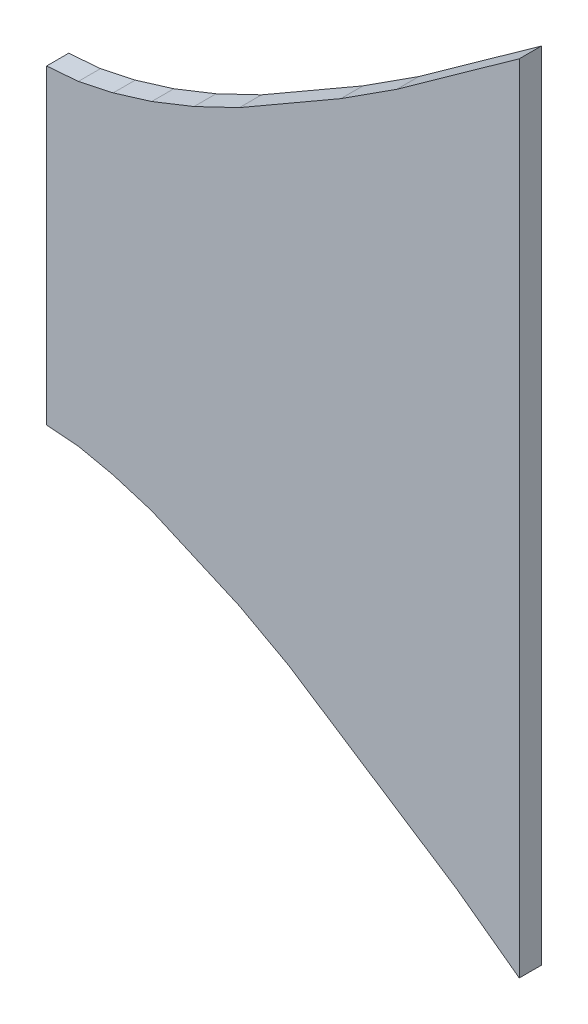
ISO-10303-21;
HEADER;
FILE_DESCRIPTION(('STEP AP214'),'2;1');
FILE_NAME('part.step','',(''),(''),'','','');
FILE_SCHEMA(('AUTOMOTIVE_DESIGN { 1 0 10303 214 1 1 1 1 }'));
ENDSEC;
DATA;
#1=APPLICATION_CONTEXT('core data for automotive mechanical design processes');
#2=APPLICATION_PROTOCOL_DEFINITION('international standard','automotive_design',2000,#1);
#3=PRODUCT_CONTEXT('',#1,'mechanical');
#4=PRODUCT('Part','Part','',(#3));
#5=PRODUCT_RELATED_PRODUCT_CATEGORY('part','',(#4));
#6=PRODUCT_DEFINITION_FORMATION('','',#4);
#7=PRODUCT_DEFINITION_CONTEXT('part definition',#1,'design');
#8=PRODUCT_DEFINITION('design','',#6,#7);
#9=PRODUCT_DEFINITION_SHAPE('','',#8);
#10=(LENGTH_UNIT() NAMED_UNIT(*) SI_UNIT(.MILLI.,.METRE.));
#11=(NAMED_UNIT(*) PLANE_ANGLE_UNIT() SI_UNIT($,.RADIAN.));
#12=(NAMED_UNIT(*) SI_UNIT($,.STERADIAN.) SOLID_ANGLE_UNIT());
#13=UNCERTAINTY_MEASURE_WITH_UNIT(LENGTH_MEASURE(1.E-05),#10,'distance_accuracy_value','');
#14=(GEOMETRIC_REPRESENTATION_CONTEXT(3) GLOBAL_UNCERTAINTY_ASSIGNED_CONTEXT((#13)) GLOBAL_UNIT_ASSIGNED_CONTEXT((#10,
#11,#12)) REPRESENTATION_CONTEXT('',''));
#15=CARTESIAN_POINT('',(0.,0.,0.));
#16=DIRECTION('',(0.,0.,1.));
#17=DIRECTION('',(1.,0.,0.));
#18=AXIS2_PLACEMENT_3D('',#15,#16,#17);
#19=CARTESIAN_POINT('',(100.160003662109,112.25,0.));
#20=DIRECTION('',(0.0781563649263617,0.996941112915651,0.));
#21=DIRECTION('',(0.996941112915651,-0.0781563649263617,0.));
#22=AXIS2_PLACEMENT_3D('',#19,#20,#21);
#23=PLANE('',#22);
#24=DIRECTION('',(0.996941112915651,-0.0781563649263616,0.));
#25=VECTOR('',#24,1.);
#26=CARTESIAN_POINT('',(100.160003662109,112.25,0.03556));
#27=LINE('',#26,#25);
#28=CARTESIAN_POINT('',(100.160003662109,112.25,0.03556));
#29=VERTEX_POINT('',#28);
#30=CARTESIAN_POINT('',(100.210998535156,112.246002197266,0.03556));
#31=VERTEX_POINT('',#30);
#32=EDGE_CURVE('E11',#29,#31,#27,.T.);
#33=ORIENTED_EDGE('',*,*,#32,.F.);
#34=DIRECTION('',(0.,0.,1.));
#35=VECTOR('',#34,1.);
#36=CARTESIAN_POINT('',(100.160003662109,112.25,0.));
#37=LINE('',#36,#35);
#38=CARTESIAN_POINT('',(100.160003662109,112.25,0.));
#39=VERTEX_POINT('',#38);
#40=EDGE_CURVE('E24',#39,#29,#37,.T.);
#41=ORIENTED_EDGE('',*,*,#40,.F.);
#42=DIRECTION('',(0.996941112915651,-0.0781563649263616,0.));
#43=VECTOR('',#42,1.);
#44=CARTESIAN_POINT('',(100.160003662109,112.25,0.));
#45=LINE('',#44,#43);
#46=CARTESIAN_POINT('',(100.210998535156,112.246002197266,0.));
#47=VERTEX_POINT('',#46);
#48=EDGE_CURVE('E154',#39,#47,#45,.T.);
#49=ORIENTED_EDGE('',*,*,#48,.T.);
#50=DIRECTION('',(0.,0.,1.));
#51=VECTOR('',#50,1.);
#52=CARTESIAN_POINT('',(100.210998535156,112.246002197266,0.));
#53=LINE('',#52,#51);
#54=EDGE_CURVE('E37',#47,#31,#53,.T.);
#55=ORIENTED_EDGE('',*,*,#54,.T.);
#56=EDGE_LOOP('',(#33,#41,#49,#55));
#57=FACE_BOUND('',#56,.T.);
#58=ADVANCED_FACE('F17',(#57),#23,.F.);
#59=CARTESIAN_POINT('',(100.210998535156,112.246002197266,0.));
#60=DIRECTION('',(0.20954728392183,0.977798514930854,0.));
#61=DIRECTION('',(0.977798514930854,-0.20954728392183,0.));
#62=AXIS2_PLACEMENT_3D('',#59,#60,#61);
#63=PLANE('',#62);
#64=DIRECTION('',(0.977798514930854,-0.20954728392183,0.));
#65=VECTOR('',#64,1.);
#66=CARTESIAN_POINT('',(100.210998535156,112.246002197266,0.03556));
#67=LINE('',#66,#65);
#68=CARTESIAN_POINT('',(100.266998291016,112.234001159668,0.03556));
#69=VERTEX_POINT('',#68);
#70=EDGE_CURVE('E266',#31,#69,#67,.T.);
#71=ORIENTED_EDGE('',*,*,#70,.F.);
#72=ORIENTED_EDGE('',*,*,#54,.F.);
#73=DIRECTION('',(0.977798514930854,-0.20954728392183,0.));
#74=VECTOR('',#73,1.);
#75=CARTESIAN_POINT('',(100.210998535156,112.246002197266,0.));
#76=LINE('',#75,#74);
#77=CARTESIAN_POINT('',(100.266998291016,112.234001159668,0.));
#78=VERTEX_POINT('',#77);
#79=EDGE_CURVE('E263',#47,#78,#76,.T.);
#80=ORIENTED_EDGE('',*,*,#79,.T.);
#81=DIRECTION('',(0.,0.,1.));
#82=VECTOR('',#81,1.);
#83=CARTESIAN_POINT('',(100.266998291016,112.234001159668,0.));
#84=LINE('',#83,#82);
#85=EDGE_CURVE('E261',#78,#69,#84,.T.);
#86=ORIENTED_EDGE('',*,*,#85,.T.);
#87=EDGE_LOOP('',(#71,#72,#80,#86));
#88=FACE_BOUND('',#87,.T.);
#89=ADVANCED_FACE('F274',(#88),#63,.F.);
#90=CARTESIAN_POINT('',(100.266998291016,112.234001159668,0.));
#91=DIRECTION('',(0.293052313581465,0.956096408059643,0.));
#92=DIRECTION('',(0.956096408059643,-0.293052313581465,0.));
#93=AXIS2_PLACEMENT_3D('',#90,#91,#92);
#94=PLANE('',#93);
#95=DIRECTION('',(0.956096408059643,-0.293052313581465,0.));
#96=VECTOR('',#95,1.);
#97=CARTESIAN_POINT('',(100.266998291016,112.234001159668,0.03556));
#98=LINE('',#97,#96);
#99=CARTESIAN_POINT('',(100.329002380371,112.214996337891,0.03556));
#100=VERTEX_POINT('',#99);
#101=EDGE_CURVE('E258',#69,#100,#98,.T.);
#102=ORIENTED_EDGE('',*,*,#101,.F.);
#103=ORIENTED_EDGE('',*,*,#85,.F.);
#104=DIRECTION('',(0.956096408059643,-0.293052313581465,0.));
#105=VECTOR('',#104,1.);
#106=CARTESIAN_POINT('',(100.266998291016,112.234001159668,0.));
#107=LINE('',#106,#105);
#108=CARTESIAN_POINT('',(100.329002380371,112.214996337891,0.));
#109=VERTEX_POINT('',#108);
#110=EDGE_CURVE('E255',#78,#109,#107,.T.);
#111=ORIENTED_EDGE('',*,*,#110,.T.);
#112=DIRECTION('',(0.,0.,1.));
#113=VECTOR('',#112,1.);
#114=CARTESIAN_POINT('',(100.329002380371,112.214996337891,0.));
#115=LINE('',#114,#113);
#116=EDGE_CURVE('E253',#109,#100,#115,.T.);
#117=ORIENTED_EDGE('',*,*,#116,.T.);
#118=EDGE_LOOP('',(#102,#103,#111,#117));
#119=FACE_BOUND('',#118,.T.);
#120=ADVANCED_FACE('F280',(#119),#94,.F.);
#121=CARTESIAN_POINT('',(100.329002380371,112.214996337891,0.));
#122=DIRECTION('',(0.402504548069156,0.915417985831415,0.));
#123=DIRECTION('',(0.915417985831415,-0.402504548069156,0.));
#124=AXIS2_PLACEMENT_3D('',#121,#122,#123);
#125=PLANE('',#124);
#126=DIRECTION('',(0.915417985831415,-0.402504548069156,0.));
#127=VECTOR('',#126,1.);
#128=CARTESIAN_POINT('',(100.329002380371,112.214996337891,0.03556));
#129=LINE('',#128,#127);
#130=CARTESIAN_POINT('',(100.470001220703,112.15299987793,0.03556));
#131=VERTEX_POINT('',#130);
#132=EDGE_CURVE('E250',#100,#131,#129,.T.);
#133=ORIENTED_EDGE('',*,*,#132,.F.);
#134=ORIENTED_EDGE('',*,*,#116,.F.);
#135=DIRECTION('',(0.915417985831415,-0.402504548069156,0.));
#136=VECTOR('',#135,1.);
#137=CARTESIAN_POINT('',(100.329002380371,112.214996337891,0.));
#138=LINE('',#137,#136);
#139=CARTESIAN_POINT('',(100.470001220703,112.15299987793,0.));
#140=VERTEX_POINT('',#139);
#141=EDGE_CURVE('E247',#109,#140,#138,.T.);
#142=ORIENTED_EDGE('',*,*,#141,.T.);
#143=DIRECTION('',(0.,0.,1.));
#144=VECTOR('',#143,1.);
#145=CARTESIAN_POINT('',(100.470001220703,112.15299987793,0.));
#146=LINE('',#145,#144);
#147=EDGE_CURVE('E245',#140,#131,#146,.T.);
#148=ORIENTED_EDGE('',*,*,#147,.T.);
#149=EDGE_LOOP('',(#133,#134,#142,#148));
#150=FACE_BOUND('',#149,.T.);
#151=ADVANCED_FACE('F282',(#150),#125,.F.);
#152=CARTESIAN_POINT('',(100.470001220703,112.15299987793,0.));
#153=DIRECTION('',(0.478055581365163,0.878329585705512,0.));
#154=DIRECTION('',(0.878329585705512,-0.478055581365163,0.));
#155=AXIS2_PLACEMENT_3D('',#152,#153,#154);
#156=PLANE('',#155);
#157=DIRECTION('',(0.878329585705512,-0.478055581365163,0.));
#158=VECTOR('',#157,1.);
#159=CARTESIAN_POINT('',(100.470001220703,112.15299987793,0.03556));
#160=LINE('',#159,#158);
#161=CARTESIAN_POINT('',(100.549003601074,112.110000610352,0.03556));
#162=VERTEX_POINT('',#161);
#163=EDGE_CURVE('E242',#131,#162,#160,.T.);
#164=ORIENTED_EDGE('',*,*,#163,.F.);
#165=ORIENTED_EDGE('',*,*,#147,.F.);
#166=DIRECTION('',(0.878329585705512,-0.478055581365163,0.));
#167=VECTOR('',#166,1.);
#168=CARTESIAN_POINT('',(100.470001220703,112.15299987793,0.));
#169=LINE('',#168,#167);
#170=CARTESIAN_POINT('',(100.549003601074,112.110000610352,0.));
#171=VERTEX_POINT('',#170);
#172=EDGE_CURVE('E239',#140,#171,#169,.T.);
#173=ORIENTED_EDGE('',*,*,#172,.T.);
#174=DIRECTION('',(0.,0.,1.));
#175=VECTOR('',#174,1.);
#176=CARTESIAN_POINT('',(100.549003601074,112.110000610352,0.));
#177=LINE('',#176,#175);
#178=EDGE_CURVE('E237',#171,#162,#177,.T.);
#179=ORIENTED_EDGE('',*,*,#178,.T.);
#180=EDGE_LOOP('',(#164,#165,#173,#179));
#181=FACE_BOUND('',#180,.T.);
#182=ADVANCED_FACE('F287',(#181),#156,.F.);
#183=CARTESIAN_POINT('',(100.549003601074,112.110000610352,0.));
#184=DIRECTION('',(0.546088689918585,0.837727367789189,0.));
#185=DIRECTION('',(0.837727367789189,-0.546088689918585,0.));
#186=AXIS2_PLACEMENT_3D('',#183,#184,#185);
#187=PLANE('',#186);
#188=DIRECTION('',(0.837727367789189,-0.546088689918585,0.));
#189=VECTOR('',#188,1.);
#190=CARTESIAN_POINT('',(100.549003601074,112.110000610352,0.03556));
#191=LINE('',#190,#189);
#192=CARTESIAN_POINT('',(100.819000244141,111.93399810791,0.03556));
#193=VERTEX_POINT('',#192);
#194=EDGE_CURVE('E234',#162,#193,#191,.T.);
#195=ORIENTED_EDGE('',*,*,#194,.F.);
#196=ORIENTED_EDGE('',*,*,#178,.F.);
#197=DIRECTION('',(0.837727367789189,-0.546088689918585,0.));
#198=VECTOR('',#197,1.);
#199=CARTESIAN_POINT('',(100.549003601074,112.110000610352,0.));
#200=LINE('',#199,#198);
#201=CARTESIAN_POINT('',(100.819000244141,111.93399810791,0.));
#202=VERTEX_POINT('',#201);
#203=EDGE_CURVE('E231',#171,#202,#200,.T.);
#204=ORIENTED_EDGE('',*,*,#203,.T.);
#205=DIRECTION('',(0.,0.,1.));
#206=VECTOR('',#205,1.);
#207=CARTESIAN_POINT('',(100.819000244141,111.93399810791,0.));
#208=LINE('',#207,#206);
#209=EDGE_CURVE('E229',#202,#193,#208,.T.);
#210=ORIENTED_EDGE('',*,*,#209,.T.);
#211=EDGE_LOOP('',(#195,#196,#204,#210));
#212=FACE_BOUND('',#211,.T.);
#213=ADVANCED_FACE('F290',(#212),#187,.F.);
#214=CARTESIAN_POINT('',(100.819000244141,111.93399810791,0.));
#215=DIRECTION('',(0.591012260431237,0.80666257383119,0.));
#216=DIRECTION('',(0.80666257383119,-0.591012260431237,0.));
#217=AXIS2_PLACEMENT_3D('',#214,#215,#216);
#218=PLANE('',#217);
#219=DIRECTION('',(0.80666257383119,-0.591012260431237,0.));
#220=VECTOR('',#219,1.);
#221=CARTESIAN_POINT('',(100.819000244141,111.93399810791,0.03556));
#222=LINE('',#221,#220);
#223=CARTESIAN_POINT('',(100.919998168945,111.860000610352,0.03556));
#224=VERTEX_POINT('',#223);
#225=EDGE_CURVE('E226',#193,#224,#222,.T.);
#226=ORIENTED_EDGE('',*,*,#225,.F.);
#227=ORIENTED_EDGE('',*,*,#209,.F.);
#228=DIRECTION('',(0.80666257383119,-0.591012260431237,0.));
#229=VECTOR('',#228,1.);
#230=CARTESIAN_POINT('',(100.819000244141,111.93399810791,0.));
#231=LINE('',#230,#229);
#232=CARTESIAN_POINT('',(100.919998168945,111.860000610352,0.));
#233=VERTEX_POINT('',#232);
#234=EDGE_CURVE('E223',#202,#233,#231,.T.);
#235=ORIENTED_EDGE('',*,*,#234,.T.);
#236=DIRECTION('',(0.,0.,1.));
#237=VECTOR('',#236,1.);
#238=CARTESIAN_POINT('',(100.919998168945,111.860000610352,0.));
#239=LINE('',#238,#237);
#240=EDGE_CURVE('E221',#233,#224,#239,.T.);
#241=ORIENTED_EDGE('',*,*,#240,.T.);
#242=EDGE_LOOP('',(#226,#227,#235,#241));
#243=FACE_BOUND('',#242,.T.);
#244=ADVANCED_FACE('F295',(#243),#218,.F.);
#245=CARTESIAN_POINT('',(100.919998168945,111.860000610352,0.));
#246=DIRECTION('',(-1.,0.,0.));
#247=DIRECTION('',(0.,1.,0.));
#248=AXIS2_PLACEMENT_3D('',#245,#246,#247);
#249=PLANE('',#248);
#250=DIRECTION('',(0.,1.,0.));
#251=VECTOR('',#250,1.);
#252=CARTESIAN_POINT('',(100.919998168945,111.860000610352,0.03556));
#253=LINE('',#252,#251);
#254=CARTESIAN_POINT('',(100.919998168945,113.139999389648,0.03556));
#255=VERTEX_POINT('',#254);
#256=EDGE_CURVE('E218',#224,#255,#253,.T.);
#257=ORIENTED_EDGE('',*,*,#256,.F.);
#258=ORIENTED_EDGE('',*,*,#240,.F.);
#259=DIRECTION('',(0.,1.,0.));
#260=VECTOR('',#259,1.);
#261=CARTESIAN_POINT('',(100.919998168945,111.860000610352,0.));
#262=LINE('',#261,#260);
#263=CARTESIAN_POINT('',(100.919998168945,113.139999389648,0.));
#264=VERTEX_POINT('',#263);
#265=EDGE_CURVE('E215',#233,#264,#262,.T.);
#266=ORIENTED_EDGE('',*,*,#265,.T.);
#267=DIRECTION('',(0.,0.,1.));
#268=VECTOR('',#267,1.);
#269=CARTESIAN_POINT('',(100.919998168945,113.139999389648,0.));
#270=LINE('',#269,#268);
#271=EDGE_CURVE('E213',#264,#255,#270,.T.);
#272=ORIENTED_EDGE('',*,*,#271,.T.);
#273=EDGE_LOOP('',(#257,#258,#266,#272));
#274=FACE_BOUND('',#273,.T.);
#275=ADVANCED_FACE('F298',(#274),#249,.F.);
#276=CARTESIAN_POINT('',(100.919998168945,113.139999389648,0.));
#277=DIRECTION('',(0.582018437092365,-0.813175589208481,0.));
#278=DIRECTION('',(-0.813175589208481,-0.582018437092365,0.));
#279=AXIS2_PLACEMENT_3D('',#276,#277,#278);
#280=PLANE('',#279);
#281=DIRECTION('',(-0.813175589208481,-0.582018437092365,0.));
#282=VECTOR('',#281,1.);
#283=CARTESIAN_POINT('',(100.919998168945,113.139999389648,0.03556));
#284=LINE('',#283,#282);
#285=CARTESIAN_POINT('',(100.722999572754,112.999000549316,0.03556));
#286=VERTEX_POINT('',#285);
#287=EDGE_CURVE('E210',#255,#286,#284,.T.);
#288=ORIENTED_EDGE('',*,*,#287,.F.);
#289=ORIENTED_EDGE('',*,*,#271,.F.);
#290=DIRECTION('',(-0.813175589208481,-0.582018437092365,0.));
#291=VECTOR('',#290,1.);
#292=CARTESIAN_POINT('',(100.919998168945,113.139999389648,0.));
#293=LINE('',#292,#291);
#294=CARTESIAN_POINT('',(100.722999572754,112.999000549316,0.));
#295=VERTEX_POINT('',#294);
#296=EDGE_CURVE('E207',#264,#295,#293,.T.);
#297=ORIENTED_EDGE('',*,*,#296,.T.);
#298=DIRECTION('',(0.,0.,1.));
#299=VECTOR('',#298,1.);
#300=CARTESIAN_POINT('',(100.722999572754,112.999000549316,0.));
#301=LINE('',#300,#299);
#302=EDGE_CURVE('E205',#295,#286,#301,.T.);
#303=ORIENTED_EDGE('',*,*,#302,.T.);
#304=EDGE_LOOP('',(#288,#289,#297,#303));
#305=FACE_BOUND('',#304,.T.);
#306=ADVANCED_FACE('F303',(#305),#280,.F.);
#307=CARTESIAN_POINT('',(100.722999572754,112.999000549316,0.));
#308=DIRECTION('',(0.541708046838841,-0.840566708828067,0.));
#309=DIRECTION('',(-0.840566708828067,-0.541708046838841,0.));
#310=AXIS2_PLACEMENT_3D('',#307,#308,#309);
#311=PLANE('',#310);
#312=DIRECTION('',(-0.840566708828067,-0.541708046838841,0.));
#313=VECTOR('',#312,1.);
#314=CARTESIAN_POINT('',(100.722999572754,112.999000549316,0.03556));
#315=LINE('',#314,#313);
#316=CARTESIAN_POINT('',(100.633003234863,112.94100189209,0.03556));
#317=VERTEX_POINT('',#316);
#318=EDGE_CURVE('E202',#286,#317,#315,.T.);
#319=ORIENTED_EDGE('',*,*,#318,.F.);
#320=ORIENTED_EDGE('',*,*,#302,.F.);
#321=DIRECTION('',(-0.840566708828067,-0.541708046838841,0.));
#322=VECTOR('',#321,1.);
#323=CARTESIAN_POINT('',(100.722999572754,112.999000549316,0.));
#324=LINE('',#323,#322);
#325=CARTESIAN_POINT('',(100.633003234863,112.94100189209,0.));
#326=VERTEX_POINT('',#325);
#327=EDGE_CURVE('E199',#295,#326,#324,.T.);
#328=ORIENTED_EDGE('',*,*,#327,.T.);
#329=DIRECTION('',(0.,0.,1.));
#330=VECTOR('',#329,1.);
#331=CARTESIAN_POINT('',(100.633003234863,112.94100189209,0.));
#332=LINE('',#331,#330);
#333=EDGE_CURVE('E197',#326,#317,#332,.T.);
#334=ORIENTED_EDGE('',*,*,#333,.T.);
#335=EDGE_LOOP('',(#319,#320,#328,#334));
#336=FACE_BOUND('',#335,.T.);
#337=ADVANCED_FACE('F306',(#336),#311,.F.);
#338=CARTESIAN_POINT('',(100.633003234863,112.94100189209,0.));
#339=DIRECTION('',(0.49957151089777,-0.866272650785721,0.));
#340=DIRECTION('',(-0.866272650785721,-0.49957151089777,0.));
#341=AXIS2_PLACEMENT_3D('',#338,#339,#340);
#342=PLANE('',#341);
#343=DIRECTION('',(-0.866272650785721,-0.49957151089777,0.));
#344=VECTOR('',#343,1.);
#345=CARTESIAN_POINT('',(100.633003234863,112.94100189209,0.03556));
#346=LINE('',#345,#344);
#347=CARTESIAN_POINT('',(100.470001220703,112.84700012207,0.03556));
#348=VERTEX_POINT('',#347);
#349=EDGE_CURVE('E194',#317,#348,#346,.T.);
#350=ORIENTED_EDGE('',*,*,#349,.F.);
#351=ORIENTED_EDGE('',*,*,#333,.F.);
#352=DIRECTION('',(-0.866272650785721,-0.49957151089777,0.));
#353=VECTOR('',#352,1.);
#354=CARTESIAN_POINT('',(100.633003234863,112.94100189209,0.));
#355=LINE('',#354,#353);
#356=CARTESIAN_POINT('',(100.470001220703,112.84700012207,0.));
#357=VERTEX_POINT('',#356);
#358=EDGE_CURVE('E191',#326,#357,#355,.T.);
#359=ORIENTED_EDGE('',*,*,#358,.T.);
#360=DIRECTION('',(0.,0.,1.));
#361=VECTOR('',#360,1.);
#362=CARTESIAN_POINT('',(100.470001220703,112.84700012207,0.));
#363=LINE('',#362,#361);
#364=EDGE_CURVE('E189',#357,#348,#363,.T.);
#365=ORIENTED_EDGE('',*,*,#364,.T.);
#366=EDGE_LOOP('',(#350,#351,#359,#365));
#367=FACE_BOUND('',#366,.T.);
#368=ADVANCED_FACE('F311',(#367),#342,.F.);
#369=CARTESIAN_POINT('',(100.470001220703,112.84700012207,0.));
#370=DIRECTION('',(0.432375640471323,-0.901693576292419,0.));
#371=DIRECTION('',(-0.901693576292419,-0.432375640471323,0.));
#372=AXIS2_PLACEMENT_3D('',#369,#370,#371);
#373=PLANE('',#372);
#374=DIRECTION('',(-0.901693576292419,-0.432375640471323,0.));
#375=VECTOR('',#374,1.);
#376=CARTESIAN_POINT('',(100.470001220703,112.84700012207,0.03556));
#377=LINE('',#376,#375);
#378=CARTESIAN_POINT('',(100.397003173828,112.811996459961,0.03556));
#379=VERTEX_POINT('',#378);
#380=EDGE_CURVE('E186',#348,#379,#377,.T.);
#381=ORIENTED_EDGE('',*,*,#380,.F.);
#382=ORIENTED_EDGE('',*,*,#364,.F.);
#383=DIRECTION('',(-0.901693576292419,-0.432375640471323,0.));
#384=VECTOR('',#383,1.);
#385=CARTESIAN_POINT('',(100.470001220703,112.84700012207,0.));
#386=LINE('',#385,#384);
#387=CARTESIAN_POINT('',(100.397003173828,112.811996459961,0.));
#388=VERTEX_POINT('',#387);
#389=EDGE_CURVE('E183',#357,#388,#386,.T.);
#390=ORIENTED_EDGE('',*,*,#389,.T.);
#391=DIRECTION('',(0.,0.,1.));
#392=VECTOR('',#391,1.);
#393=CARTESIAN_POINT('',(100.397003173828,112.811996459961,0.));
#394=LINE('',#393,#392);
#395=EDGE_CURVE('E181',#388,#379,#394,.T.);
#396=ORIENTED_EDGE('',*,*,#395,.T.);
#397=EDGE_LOOP('',(#381,#382,#390,#396));
#398=FACE_BOUND('',#397,.T.);
#399=ADVANCED_FACE('F314',(#398),#373,.F.);
#400=CARTESIAN_POINT('',(100.397003173828,112.811996459961,0.));
#401=DIRECTION('',(0.368944191946395,-0.929451549694239,0.));
#402=DIRECTION('',(-0.929451549694239,-0.368944191946395,0.));
#403=AXIS2_PLACEMENT_3D('',#400,#401,#402);
#404=PLANE('',#403);
#405=DIRECTION('',(-0.929451549694239,-0.368944191946395,0.));
#406=VECTOR('',#405,1.);
#407=CARTESIAN_POINT('',(100.397003173828,112.811996459961,0.03556));
#408=LINE('',#407,#406);
#409=CARTESIAN_POINT('',(100.329002380371,112.785003662109,0.03556));
#410=VERTEX_POINT('',#409);
#411=EDGE_CURVE('E178',#379,#410,#408,.T.);
#412=ORIENTED_EDGE('',*,*,#411,.F.);
#413=ORIENTED_EDGE('',*,*,#395,.F.);
#414=DIRECTION('',(-0.929451549694239,-0.368944191946395,0.));
#415=VECTOR('',#414,1.);
#416=CARTESIAN_POINT('',(100.397003173828,112.811996459961,0.));
#417=LINE('',#416,#415);
#418=CARTESIAN_POINT('',(100.329002380371,112.785003662109,0.));
#419=VERTEX_POINT('',#418);
#420=EDGE_CURVE('E175',#388,#419,#417,.T.);
#421=ORIENTED_EDGE('',*,*,#420,.T.);
#422=DIRECTION('',(0.,0.,1.));
#423=VECTOR('',#422,1.);
#424=CARTESIAN_POINT('',(100.329002380371,112.785003662109,0.));
#425=LINE('',#424,#423);
#426=EDGE_CURVE('E173',#419,#410,#425,.T.);
#427=ORIENTED_EDGE('',*,*,#426,.T.);
#428=EDGE_LOOP('',(#412,#413,#421,#427));
#429=FACE_BOUND('',#428,.T.);
#430=ADVANCED_FACE('F319',(#429),#404,.F.);
#431=CARTESIAN_POINT('',(100.329002380371,112.785003662109,0.));
#432=DIRECTION('',(0.293052313581465,-0.956096408059643,0.));
#433=DIRECTION('',(-0.956096408059643,-0.293052313581465,0.));
#434=AXIS2_PLACEMENT_3D('',#431,#432,#433);
#435=PLANE('',#434);
#436=DIRECTION('',(-0.956096408059643,-0.293052313581465,0.));
#437=VECTOR('',#436,1.);
#438=CARTESIAN_POINT('',(100.329002380371,112.785003662109,0.03556));
#439=LINE('',#438,#437);
#440=CARTESIAN_POINT('',(100.266998291016,112.765998840332,0.03556));
#441=VERTEX_POINT('',#440);
#442=EDGE_CURVE('E170',#410,#441,#439,.T.);
#443=ORIENTED_EDGE('',*,*,#442,.F.);
#444=ORIENTED_EDGE('',*,*,#426,.F.);
#445=DIRECTION('',(-0.956096408059643,-0.293052313581465,0.));
#446=VECTOR('',#445,1.);
#447=CARTESIAN_POINT('',(100.329002380371,112.785003662109,0.));
#448=LINE('',#447,#446);
#449=CARTESIAN_POINT('',(100.266998291016,112.765998840332,0.));
#450=VERTEX_POINT('',#449);
#451=EDGE_CURVE('E167',#419,#450,#448,.T.);
#452=ORIENTED_EDGE('',*,*,#451,.T.);
#453=DIRECTION('',(0.,0.,1.));
#454=VECTOR('',#453,1.);
#455=CARTESIAN_POINT('',(100.266998291016,112.765998840332,0.));
#456=LINE('',#455,#454);
#457=EDGE_CURVE('E165',#450,#441,#456,.T.);
#458=ORIENTED_EDGE('',*,*,#457,.T.);
#459=EDGE_LOOP('',(#443,#444,#452,#458));
#460=FACE_BOUND('',#459,.T.);
#461=ADVANCED_FACE('F322',(#460),#435,.F.);
#462=CARTESIAN_POINT('',(100.266998291016,112.765998840332,0.));
#463=DIRECTION('',(0.20954728392183,-0.977798514930854,0.));
#464=DIRECTION('',(-0.977798514930854,-0.20954728392183,0.));
#465=AXIS2_PLACEMENT_3D('',#462,#463,#464);
#466=PLANE('',#465);
#467=DIRECTION('',(-0.977798514930854,-0.20954728392183,0.));
#468=VECTOR('',#467,1.);
#469=CARTESIAN_POINT('',(100.266998291016,112.765998840332,0.03556));
#470=LINE('',#469,#468);
#471=CARTESIAN_POINT('',(100.210998535156,112.753997802734,0.03556));
#472=VERTEX_POINT('',#471);
#473=EDGE_CURVE('E162',#441,#472,#470,.T.);
#474=ORIENTED_EDGE('',*,*,#473,.F.);
#475=ORIENTED_EDGE('',*,*,#457,.F.);
#476=DIRECTION('',(-0.977798514930854,-0.20954728392183,0.));
#477=VECTOR('',#476,1.);
#478=CARTESIAN_POINT('',(100.266998291016,112.765998840332,0.));
#479=LINE('',#478,#477);
#480=CARTESIAN_POINT('',(100.210998535156,112.753997802734,0.));
#481=VERTEX_POINT('',#480);
#482=EDGE_CURVE('E160',#450,#481,#479,.T.);
#483=ORIENTED_EDGE('',*,*,#482,.T.);
#484=DIRECTION('',(0.,0.,1.));
#485=VECTOR('',#484,1.);
#486=CARTESIAN_POINT('',(100.210998535156,112.753997802734,0.));
#487=LINE('',#486,#485);
#488=EDGE_CURVE('E145',#481,#472,#487,.T.);
#489=ORIENTED_EDGE('',*,*,#488,.T.);
#490=EDGE_LOOP('',(#474,#475,#483,#489));
#491=FACE_BOUND('',#490,.T.);
#492=ADVANCED_FACE('F325',(#491),#466,.F.);
#493=CARTESIAN_POINT('',(100.210998535156,112.753997802734,0.));
#494=DIRECTION('',(0.0781563649263617,-0.996941112915651,0.));
#495=DIRECTION('',(-0.996941112915651,-0.0781563649263617,0.));
#496=AXIS2_PLACEMENT_3D('',#493,#494,#495);
#497=PLANE('',#496);
#498=DIRECTION('',(-0.996941112915651,-0.0781563649263616,0.));
#499=VECTOR('',#498,1.);
#500=CARTESIAN_POINT('',(100.210998535156,112.753997802734,0.03556));
#501=LINE('',#500,#499);
#502=CARTESIAN_POINT('',(100.160003662109,112.75,0.03556));
#503=VERTEX_POINT('',#502);
#504=EDGE_CURVE('E149',#472,#503,#501,.T.);
#505=ORIENTED_EDGE('',*,*,#504,.F.);
#506=ORIENTED_EDGE('',*,*,#488,.F.);
#507=DIRECTION('',(-0.996941112915651,-0.0781563649263616,0.));
#508=VECTOR('',#507,1.);
#509=CARTESIAN_POINT('',(100.210998535156,112.753997802734,0.));
#510=LINE('',#509,#508);
#511=CARTESIAN_POINT('',(100.160003662109,112.75,0.));
#512=VERTEX_POINT('',#511);
#513=EDGE_CURVE('E141',#481,#512,#510,.T.);
#514=ORIENTED_EDGE('',*,*,#513,.T.);
#515=DIRECTION('',(0.,0.,1.));
#516=VECTOR('',#515,1.);
#517=CARTESIAN_POINT('',(100.160003662109,112.75,0.));
#518=LINE('',#517,#516);
#519=EDGE_CURVE('E131',#512,#503,#518,.T.);
#520=ORIENTED_EDGE('',*,*,#519,.T.);
#521=EDGE_LOOP('',(#505,#506,#514,#520));
#522=FACE_BOUND('',#521,.T.);
#523=ADVANCED_FACE('F144',(#522),#497,.F.);
#524=CARTESIAN_POINT('',(100.160003662109,112.75,0.));
#525=DIRECTION('',(1.,0.,0.));
#526=DIRECTION('',(0.,-1.,0.));
#527=AXIS2_PLACEMENT_3D('',#524,#525,#526);
#528=PLANE('',#527);
#529=DIRECTION('',(0.,-1.,0.));
#530=VECTOR('',#529,1.);
#531=CARTESIAN_POINT('',(100.160003662109,112.75,0.03556));
#532=LINE('',#531,#530);
#533=EDGE_CURVE('E137',#503,#29,#532,.T.);
#534=ORIENTED_EDGE('',*,*,#533,.F.);
#535=ORIENTED_EDGE('',*,*,#519,.F.);
#536=DIRECTION('',(0.,-1.,0.));
#537=VECTOR('',#536,1.);
#538=CARTESIAN_POINT('',(100.160003662109,112.75,0.));
#539=LINE('',#538,#537);
#540=EDGE_CURVE('E135',#512,#39,#539,.T.);
#541=ORIENTED_EDGE('',*,*,#540,.T.);
#542=ORIENTED_EDGE('',*,*,#40,.T.);
#543=EDGE_LOOP('',(#534,#535,#541,#542));
#544=FACE_BOUND('',#543,.T.);
#545=ADVANCED_FACE('F133',(#544),#528,.F.);
#546=CARTESIAN_POINT('',(100.160003662109,112.25,0.));
#547=DIRECTION('',(0.,0.,1.));
#548=DIRECTION('',(1.,0.,0.));
#549=AXIS2_PLACEMENT_3D('',#546,#547,#548);
#550=PLANE('',#549);
#551=ORIENTED_EDGE('',*,*,#540,.F.);
#552=ORIENTED_EDGE('',*,*,#513,.F.);
#553=ORIENTED_EDGE('',*,*,#482,.F.);
#554=ORIENTED_EDGE('',*,*,#451,.F.);
#555=ORIENTED_EDGE('',*,*,#420,.F.);
#556=ORIENTED_EDGE('',*,*,#389,.F.);
#557=ORIENTED_EDGE('',*,*,#358,.F.);
#558=ORIENTED_EDGE('',*,*,#327,.F.);
#559=ORIENTED_EDGE('',*,*,#296,.F.);
#560=ORIENTED_EDGE('',*,*,#265,.F.);
#561=ORIENTED_EDGE('',*,*,#234,.F.);
#562=ORIENTED_EDGE('',*,*,#203,.F.);
#563=ORIENTED_EDGE('',*,*,#172,.F.);
#564=ORIENTED_EDGE('',*,*,#141,.F.);
#565=ORIENTED_EDGE('',*,*,#110,.F.);
#566=ORIENTED_EDGE('',*,*,#79,.F.);
#567=ORIENTED_EDGE('',*,*,#48,.F.);
#568=EDGE_LOOP('',(#551,#552,#553,#554,#555,#556,#557,#558,#559,#560,#561,#562,#563,#564,#565,
#566,#567));
#569=FACE_BOUND('',#568,.T.);
#570=ADVANCED_FACE('F152',(#569),#550,.F.);
#571=CARTESIAN_POINT('',(100.160003662109,112.25,0.03556));
#572=DIRECTION('',(0.,0.,1.));
#573=DIRECTION('',(1.,0.,0.));
#574=AXIS2_PLACEMENT_3D('',#571,#572,#573);
#575=PLANE('',#574);
#576=ORIENTED_EDGE('',*,*,#32,.T.);
#577=ORIENTED_EDGE('',*,*,#70,.T.);
#578=ORIENTED_EDGE('',*,*,#101,.T.);
#579=ORIENTED_EDGE('',*,*,#132,.T.);
#580=ORIENTED_EDGE('',*,*,#163,.T.);
#581=ORIENTED_EDGE('',*,*,#194,.T.);
#582=ORIENTED_EDGE('',*,*,#225,.T.);
#583=ORIENTED_EDGE('',*,*,#256,.T.);
#584=ORIENTED_EDGE('',*,*,#287,.T.);
#585=ORIENTED_EDGE('',*,*,#318,.T.);
#586=ORIENTED_EDGE('',*,*,#349,.T.);
#587=ORIENTED_EDGE('',*,*,#380,.T.);
#588=ORIENTED_EDGE('',*,*,#411,.T.);
#589=ORIENTED_EDGE('',*,*,#442,.T.);
#590=ORIENTED_EDGE('',*,*,#473,.T.);
#591=ORIENTED_EDGE('',*,*,#504,.T.);
#592=ORIENTED_EDGE('',*,*,#533,.T.);
#593=EDGE_LOOP('',(#576,#577,#578,#579,#580,#581,#582,#583,#584,#585,#586,#587,#588,#589,#590,
#591,#592));
#594=FACE_BOUND('',#593,.T.);
#595=ADVANCED_FACE('F277',(#594),#575,.T.);
#596=CLOSED_SHELL('',(#58,#89,#120,#151,#182,#213,#244,#275,#306,#337,#368,#399,#430,#461,#492,
#523,#545,#570,#595));
#597=MANIFOLD_SOLID_BREP('B1',#596);
#598=ADVANCED_BREP_SHAPE_REPRESENTATION('',(#18,#597),#14);
#599=SHAPE_DEFINITION_REPRESENTATION(#9,#598);
ENDSEC;
END-ISO-10303-21;
